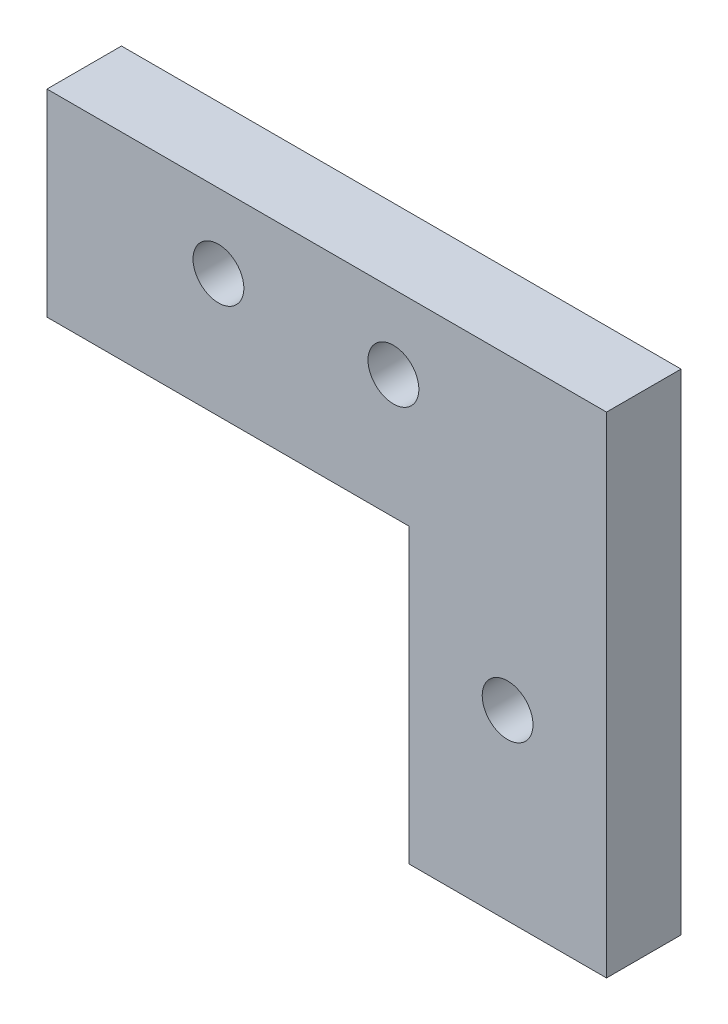
ISO-10303-21;
HEADER;
FILE_DESCRIPTION(('STEP AP214'),'2;1');
FILE_NAME('part.step','',(''),(''),'','','');
FILE_SCHEMA(('AUTOMOTIVE_DESIGN { 1 0 10303 214 1 1 1 1 }'));
ENDSEC;
DATA;
#1=APPLICATION_CONTEXT('core data for automotive mechanical design processes');
#2=APPLICATION_PROTOCOL_DEFINITION('international standard','automotive_design',2000,#1);
#3=PRODUCT_CONTEXT('',#1,'mechanical');
#4=PRODUCT('Part','Part','',(#3));
#5=PRODUCT_RELATED_PRODUCT_CATEGORY('part','',(#4));
#6=PRODUCT_DEFINITION_FORMATION('','',#4);
#7=PRODUCT_DEFINITION_CONTEXT('part definition',#1,'design');
#8=PRODUCT_DEFINITION('design','',#6,#7);
#9=PRODUCT_DEFINITION_SHAPE('','',#8);
#10=(LENGTH_UNIT() NAMED_UNIT(*) SI_UNIT(.MILLI.,.METRE.));
#11=(NAMED_UNIT(*) PLANE_ANGLE_UNIT() SI_UNIT($,.RADIAN.));
#12=(NAMED_UNIT(*) SI_UNIT($,.STERADIAN.) SOLID_ANGLE_UNIT());
#13=UNCERTAINTY_MEASURE_WITH_UNIT(LENGTH_MEASURE(1.E-05),#10,'distance_accuracy_value','');
#14=(GEOMETRIC_REPRESENTATION_CONTEXT(3) GLOBAL_UNCERTAINTY_ASSIGNED_CONTEXT((#13)) GLOBAL_UNIT_ASSIGNED_CONTEXT((#10,
#11,#12)) REPRESENTATION_CONTEXT('',''));
#15=CARTESIAN_POINT('',(0.,0.,0.));
#16=DIRECTION('',(0.,0.,1.));
#17=DIRECTION('',(1.,0.,0.));
#18=AXIS2_PLACEMENT_3D('',#15,#16,#17);
#19=CARTESIAN_POINT('',(0.,0.,42.65));
#20=DIRECTION('',(0.,-1.,0.));
#21=DIRECTION('',(1.,0.,0.));
#22=AXIS2_PLACEMENT_3D('',#19,#20,#21);
#23=PLANE('',#22);
#24=DIRECTION('',(0.,0.,-1.));
#25=VECTOR('',#24,1.);
#26=CARTESIAN_POINT('',(-25.65,0.,42.65));
#27=LINE('',#26,#25);
#28=CARTESIAN_POINT('',(-25.65,0.,5.28));
#29=VERTEX_POINT('',#28);
#30=CARTESIAN_POINT('',(-25.65,0.,0.));
#31=VERTEX_POINT('',#30);
#32=EDGE_CURVE('E11',#29,#31,#27,.T.);
#33=ORIENTED_EDGE('',*,*,#32,.F.);
#34=DIRECTION('',(-1.,0.,0.));
#35=VECTOR('',#34,1.);
#36=CARTESIAN_POINT('',(-36.4186276215853,0.,5.28));
#37=LINE('',#36,#35);
#38=CARTESIAN_POINT('',(14.,0.,5.28));
#39=VERTEX_POINT('',#38);
#40=EDGE_CURVE('E97',#39,#29,#37,.T.);
#41=ORIENTED_EDGE('',*,*,#40,.F.);
#42=DIRECTION('',(0.,0.,-1.));
#43=VECTOR('',#42,1.);
#44=CARTESIAN_POINT('',(14.,0.,42.65));
#45=LINE('',#44,#43);
#46=CARTESIAN_POINT('',(14.,0.,0.));
#47=VERTEX_POINT('',#46);
#48=EDGE_CURVE('E67',#39,#47,#45,.T.);
#49=ORIENTED_EDGE('',*,*,#48,.T.);
#50=DIRECTION('',(-1.,0.,0.));
#51=VECTOR('',#50,1.);
#52=CARTESIAN_POINT('',(0.,0.,0.));
#53=LINE('',#52,#51);
#54=EDGE_CURVE('E145',#47,#31,#53,.T.);
#55=ORIENTED_EDGE('',*,*,#54,.T.);
#56=EDGE_LOOP('',(#33,#41,#49,#55));
#57=FACE_BOUND('',#56,.T.);
#58=ADVANCED_FACE('F43',(#57),#23,.F.);
#59=CARTESIAN_POINT('',(-25.65,0.,42.65));
#60=DIRECTION('',(1.,0.,0.));
#61=DIRECTION('',(0.,1.,0.));
#62=AXIS2_PLACEMENT_3D('',#59,#60,#61);
#63=PLANE('',#62);
#64=DIRECTION('',(0.,0.,-1.));
#65=VECTOR('',#64,1.);
#66=CARTESIAN_POINT('',(-25.65,-14.,42.65));
#67=LINE('',#66,#65);
#68=CARTESIAN_POINT('',(-25.65,-14.,5.28));
#69=VERTEX_POINT('',#68);
#70=CARTESIAN_POINT('',(-25.65,-14.,0.));
#71=VERTEX_POINT('',#70);
#72=EDGE_CURVE('E52',#69,#71,#67,.T.);
#73=ORIENTED_EDGE('',*,*,#72,.F.);
#74=DIRECTION('',(0.,1.,0.));
#75=VECTOR('',#74,1.);
#76=CARTESIAN_POINT('',(-25.65,0.,5.28));
#77=LINE('',#76,#75);
#78=EDGE_CURVE('E188',#69,#29,#77,.T.);
#79=ORIENTED_EDGE('',*,*,#78,.T.);
#80=ORIENTED_EDGE('',*,*,#32,.T.);
#81=DIRECTION('',(0.,-1.,0.));
#82=VECTOR('',#81,1.);
#83=CARTESIAN_POINT('',(-25.65,0.,0.));
#84=LINE('',#83,#82);
#85=EDGE_CURVE('E141',#31,#71,#84,.T.);
#86=ORIENTED_EDGE('',*,*,#85,.T.);
#87=EDGE_LOOP('',(#73,#79,#80,#86));
#88=FACE_BOUND('',#87,.T.);
#89=ADVANCED_FACE('F142',(#88),#63,.F.);
#90=CARTESIAN_POINT('',(0.,-14.,42.65));
#91=DIRECTION('',(0.,-1.,0.));
#92=DIRECTION('',(1.,0.,0.));
#93=AXIS2_PLACEMENT_3D('',#90,#91,#92);
#94=PLANE('',#93);
#95=DIRECTION('',(1.,0.,0.));
#96=VECTOR('',#95,1.);
#97=CARTESIAN_POINT('',(0.,-14.,5.28));
#98=LINE('',#97,#96);
#99=CARTESIAN_POINT('',(0.,-14.,5.28));
#100=VERTEX_POINT('',#99);
#101=EDGE_CURVE('E138',#69,#100,#98,.T.);
#102=ORIENTED_EDGE('',*,*,#101,.F.);
#103=ORIENTED_EDGE('',*,*,#72,.T.);
#104=DIRECTION('',(-1.,0.,0.));
#105=VECTOR('',#104,1.);
#106=CARTESIAN_POINT('',(0.,-14.,0.));
#107=LINE('',#106,#105);
#108=CARTESIAN_POINT('',(0.,-14.,0.));
#109=VERTEX_POINT('',#108);
#110=EDGE_CURVE('E137',#109,#71,#107,.T.);
#111=ORIENTED_EDGE('',*,*,#110,.F.);
#112=DIRECTION('',(0.,0.,-1.));
#113=VECTOR('',#112,1.);
#114=CARTESIAN_POINT('',(0.,-14.,42.65));
#115=LINE('',#114,#113);
#116=EDGE_CURVE('E125',#100,#109,#115,.T.);
#117=ORIENTED_EDGE('',*,*,#116,.F.);
#118=EDGE_LOOP('',(#102,#103,#111,#117));
#119=FACE_BOUND('',#118,.T.);
#120=ADVANCED_FACE('F134',(#119),#94,.T.);
#121=CARTESIAN_POINT('',(0.,0.,42.65));
#122=DIRECTION('',(1.,0.,0.));
#123=DIRECTION('',(0.,1.,0.));
#124=AXIS2_PLACEMENT_3D('',#121,#122,#123);
#125=PLANE('',#124);
#126=DIRECTION('',(0.,0.,-1.));
#127=VECTOR('',#126,1.);
#128=CARTESIAN_POINT('',(0.,-34.73,42.65));
#129=LINE('',#128,#127);
#130=CARTESIAN_POINT('',(0.,-34.73,5.28));
#131=VERTEX_POINT('',#130);
#132=CARTESIAN_POINT('',(0.,-34.73,0.));
#133=VERTEX_POINT('',#132);
#134=EDGE_CURVE('E117',#131,#133,#129,.T.);
#135=ORIENTED_EDGE('',*,*,#134,.F.);
#136=DIRECTION('',(0.,1.,0.));
#137=VECTOR('',#136,1.);
#138=CARTESIAN_POINT('',(0.,0.,5.28));
#139=LINE('',#138,#137);
#140=EDGE_CURVE('E102',#131,#100,#139,.T.);
#141=ORIENTED_EDGE('',*,*,#140,.T.);
#142=ORIENTED_EDGE('',*,*,#116,.T.);
#143=DIRECTION('',(0.,-1.,0.));
#144=VECTOR('',#143,1.);
#145=CARTESIAN_POINT('',(0.,0.,0.));
#146=LINE('',#145,#144);
#147=EDGE_CURVE('E151',#109,#133,#146,.T.);
#148=ORIENTED_EDGE('',*,*,#147,.T.);
#149=EDGE_LOOP('',(#135,#141,#142,#148));
#150=FACE_BOUND('',#149,.T.);
#151=ADVANCED_FACE('F247',(#150),#125,.F.);
#152=CARTESIAN_POINT('',(0.,-34.73,42.65));
#153=DIRECTION('',(0.,1.,0.));
#154=DIRECTION('',(0.,0.,1.));
#155=AXIS2_PLACEMENT_3D('',#152,#153,#154);
#156=PLANE('',#155);
#157=DIRECTION('',(0.,0.,-1.));
#158=VECTOR('',#157,1.);
#159=CARTESIAN_POINT('',(14.,-34.73,42.65));
#160=LINE('',#159,#158);
#161=CARTESIAN_POINT('',(14.,-34.73,5.28));
#162=VERTEX_POINT('',#161);
#163=CARTESIAN_POINT('',(14.,-34.73,0.));
#164=VERTEX_POINT('',#163);
#165=EDGE_CURVE('E113',#162,#164,#160,.T.);
#166=ORIENTED_EDGE('',*,*,#165,.F.);
#167=DIRECTION('',(-1.,0.,0.));
#168=VECTOR('',#167,1.);
#169=CARTESIAN_POINT('',(-36.4186276215853,-34.73,5.28));
#170=LINE('',#169,#168);
#171=EDGE_CURVE('E59',#162,#131,#170,.T.);
#172=ORIENTED_EDGE('',*,*,#171,.T.);
#173=ORIENTED_EDGE('',*,*,#134,.T.);
#174=DIRECTION('',(1.,0.,0.));
#175=VECTOR('',#174,1.);
#176=CARTESIAN_POINT('',(0.,-34.73,0.));
#177=LINE('',#176,#175);
#178=EDGE_CURVE('E119',#133,#164,#177,.T.);
#179=ORIENTED_EDGE('',*,*,#178,.T.);
#180=EDGE_LOOP('',(#166,#172,#173,#179));
#181=FACE_BOUND('',#180,.T.);
#182=ADVANCED_FACE('F160',(#181),#156,.F.);
#183=CARTESIAN_POINT('',(14.,0.,42.65));
#184=DIRECTION('',(1.,0.,0.));
#185=DIRECTION('',(0.,1.,0.));
#186=AXIS2_PLACEMENT_3D('',#183,#184,#185);
#187=PLANE('',#186);
#188=DIRECTION('',(0.,1.,0.));
#189=VECTOR('',#188,1.);
#190=CARTESIAN_POINT('',(14.,0.,5.28));
#191=LINE('',#190,#189);
#192=EDGE_CURVE('E95',#162,#39,#191,.T.);
#193=ORIENTED_EDGE('',*,*,#192,.F.);
#194=ORIENTED_EDGE('',*,*,#165,.T.);
#195=DIRECTION('',(0.,-1.,0.));
#196=VECTOR('',#195,1.);
#197=CARTESIAN_POINT('',(14.,0.,0.));
#198=LINE('',#197,#196);
#199=EDGE_CURVE('E111',#47,#164,#198,.T.);
#200=ORIENTED_EDGE('',*,*,#199,.F.);
#201=ORIENTED_EDGE('',*,*,#48,.F.);
#202=EDGE_LOOP('',(#193,#194,#200,#201));
#203=FACE_BOUND('',#202,.T.);
#204=ADVANCED_FACE('F109',(#203),#187,.T.);
#205=CARTESIAN_POINT('',(0.,0.,0.));
#206=DIRECTION('',(0.,0.,1.));
#207=DIRECTION('',(1.,0.,0.));
#208=AXIS2_PLACEMENT_3D('',#205,#206,#207);
#209=PLANE('',#208);
#210=CARTESIAN_POINT('',(-1.10000000000001,-5.25,0.));
#211=DIRECTION('',(0.,0.,-1.));
#212=DIRECTION('',(-1.,0.,0.));
#213=AXIS2_PLACEMENT_3D('',#210,#211,#212);
#214=CIRCLE('',#213,1.825);
#215=CARTESIAN_POINT('',(-2.92500000000001,-5.25,0.));
#216=VERTEX_POINT('',#215);
#217=EDGE_CURVE('E184',#216,#216,#214,.T.);
#218=ORIENTED_EDGE('',*,*,#217,.F.);
#219=EDGE_LOOP('',(#218));
#220=FACE_BOUND('',#219,.T.);
#221=CARTESIAN_POINT('',(-13.5,-5.25,0.));
#222=DIRECTION('',(0.,0.,-1.));
#223=DIRECTION('',(-1.,0.,0.));
#224=AXIS2_PLACEMENT_3D('',#221,#222,#223);
#225=CIRCLE('',#224,1.825);
#226=CARTESIAN_POINT('',(-15.325,-5.25,0.));
#227=VERTEX_POINT('',#226);
#228=EDGE_CURVE('E176',#227,#227,#225,.T.);
#229=ORIENTED_EDGE('',*,*,#228,.F.);
#230=EDGE_LOOP('',(#229));
#231=FACE_BOUND('',#230,.T.);
#232=CARTESIAN_POINT('',(6.98999999999999,-21.8,0.));
#233=DIRECTION('',(0.,0.,-1.));
#234=DIRECTION('',(-1.,0.,0.));
#235=AXIS2_PLACEMENT_3D('',#232,#233,#234);
#236=CIRCLE('',#235,1.825);
#237=CARTESIAN_POINT('',(5.16499999999999,-21.8,0.));
#238=VERTEX_POINT('',#237);
#239=EDGE_CURVE('E166',#238,#238,#236,.T.);
#240=ORIENTED_EDGE('',*,*,#239,.F.);
#241=EDGE_LOOP('',(#240));
#242=FACE_BOUND('',#241,.T.);
#243=ORIENTED_EDGE('',*,*,#54,.F.);
#244=ORIENTED_EDGE('',*,*,#199,.T.);
#245=ORIENTED_EDGE('',*,*,#178,.F.);
#246=ORIENTED_EDGE('',*,*,#147,.F.);
#247=ORIENTED_EDGE('',*,*,#110,.T.);
#248=ORIENTED_EDGE('',*,*,#85,.F.);
#249=EDGE_LOOP('',(#243,#244,#245,#246,#247,#248));
#250=FACE_BOUND('',#249,.T.);
#251=ADVANCED_FACE('F148',(#220,#231,#242,#250),#209,.F.);
#252=CARTESIAN_POINT('',(6.98999999999999,-21.8,0.));
#253=DIRECTION('',(0.,0.,-1.));
#254=DIRECTION('',(-1.,0.,0.));
#255=AXIS2_PLACEMENT_3D('',#252,#253,#254);
#256=CYLINDRICAL_SURFACE('',#255,1.8);
#257=CARTESIAN_POINT('',(6.98999999999999,-21.8,5.28));
#258=DIRECTION('',(0.,0.,-1.));
#259=DIRECTION('',(-1.,0.,0.));
#260=AXIS2_PLACEMENT_3D('',#257,#258,#259);
#261=CIRCLE('',#260,1.8);
#262=CARTESIAN_POINT('',(5.18999999999999,-21.8,5.28));
#263=VERTEX_POINT('',#262);
#264=EDGE_CURVE('E103',#263,#263,#261,.F.);
#265=ORIENTED_EDGE('',*,*,#264,.T.);
#266=EDGE_LOOP('',(#265));
#267=FACE_BOUND('',#266,.T.);
#268=CARTESIAN_POINT('',(6.98999999999999,-21.8,0.0250000000000025));
#269=DIRECTION('',(0.,0.,-1.));
#270=DIRECTION('',(-1.,0.,0.));
#271=AXIS2_PLACEMENT_3D('',#268,#269,#270);
#272=CIRCLE('',#271,1.8);
#273=CARTESIAN_POINT('',(5.18999999999999,-21.8,0.0250000000000025));
#274=VERTEX_POINT('',#273);
#275=EDGE_CURVE('E163',#274,#274,#272,.T.);
#276=ORIENTED_EDGE('',*,*,#275,.T.);
#277=EDGE_LOOP('',(#276));
#278=FACE_BOUND('',#277,.T.);
#279=ADVANCED_FACE('F218',(#267,#278),#256,.F.);
#280=CARTESIAN_POINT('',(6.98999999999999,-21.8,0.));
#281=DIRECTION('',(0.,0.,-1.));
#282=DIRECTION('',(-1.,0.,0.));
#283=AXIS2_PLACEMENT_3D('',#280,#281,#282);
#284=CONICAL_SURFACE('',#283,1.825,0.785398163397414);
#285=ORIENTED_EDGE('',*,*,#275,.F.);
#286=EDGE_LOOP('',(#285));
#287=FACE_BOUND('',#286,.T.);
#288=ORIENTED_EDGE('',*,*,#239,.T.);
#289=EDGE_LOOP('',(#288));
#290=FACE_BOUND('',#289,.T.);
#291=ADVANCED_FACE('F221',(#287,#290),#284,.F.);
#292=CARTESIAN_POINT('',(-13.5,-5.25,0.));
#293=DIRECTION('',(0.,0.,-1.));
#294=DIRECTION('',(-1.,0.,0.));
#295=AXIS2_PLACEMENT_3D('',#292,#293,#294);
#296=CYLINDRICAL_SURFACE('',#295,1.8);
#297=CARTESIAN_POINT('',(-13.5,-5.25,5.28));
#298=DIRECTION('',(0.,0.,-1.));
#299=DIRECTION('',(-1.,0.,0.));
#300=AXIS2_PLACEMENT_3D('',#297,#298,#299);
#301=CIRCLE('',#300,1.8);
#302=CARTESIAN_POINT('',(-15.3,-5.25,5.28));
#303=VERTEX_POINT('',#302);
#304=EDGE_CURVE('E199',#303,#303,#301,.F.);
#305=ORIENTED_EDGE('',*,*,#304,.T.);
#306=EDGE_LOOP('',(#305));
#307=FACE_BOUND('',#306,.T.);
#308=CARTESIAN_POINT('',(-13.5,-5.25,0.0250000000000025));
#309=DIRECTION('',(0.,0.,-1.));
#310=DIRECTION('',(-1.,0.,0.));
#311=AXIS2_PLACEMENT_3D('',#308,#309,#310);
#312=CIRCLE('',#311,1.8);
#313=CARTESIAN_POINT('',(-15.3,-5.25,0.0250000000000025));
#314=VERTEX_POINT('',#313);
#315=EDGE_CURVE('E172',#314,#314,#312,.T.);
#316=ORIENTED_EDGE('',*,*,#315,.T.);
#317=EDGE_LOOP('',(#316));
#318=FACE_BOUND('',#317,.T.);
#319=ADVANCED_FACE('F227',(#307,#318),#296,.F.);
#320=CARTESIAN_POINT('',(-13.5,-5.25,0.));
#321=DIRECTION('',(0.,0.,-1.));
#322=DIRECTION('',(-1.,0.,0.));
#323=AXIS2_PLACEMENT_3D('',#320,#321,#322);
#324=CONICAL_SURFACE('',#323,1.825,0.785398163397414);
#325=ORIENTED_EDGE('',*,*,#315,.F.);
#326=EDGE_LOOP('',(#325));
#327=FACE_BOUND('',#326,.T.);
#328=ORIENTED_EDGE('',*,*,#228,.T.);
#329=EDGE_LOOP('',(#328));
#330=FACE_BOUND('',#329,.T.);
#331=ADVANCED_FACE('F282',(#327,#330),#324,.F.);
#332=CARTESIAN_POINT('',(-1.10000000000001,-5.25,0.));
#333=DIRECTION('',(0.,0.,-1.));
#334=DIRECTION('',(-1.,0.,0.));
#335=AXIS2_PLACEMENT_3D('',#332,#333,#334);
#336=CYLINDRICAL_SURFACE('',#335,1.8);
#337=CARTESIAN_POINT('',(-1.10000000000001,-5.25,5.28));
#338=DIRECTION('',(0.,0.,-1.));
#339=DIRECTION('',(-1.,0.,0.));
#340=AXIS2_PLACEMENT_3D('',#337,#338,#339);
#341=CIRCLE('',#340,1.8);
#342=CARTESIAN_POINT('',(-2.90000000000001,-5.25,5.28));
#343=VERTEX_POINT('',#342);
#344=EDGE_CURVE('E46',#343,#343,#341,.F.);
#345=ORIENTED_EDGE('',*,*,#344,.T.);
#346=EDGE_LOOP('',(#345));
#347=FACE_BOUND('',#346,.T.);
#348=CARTESIAN_POINT('',(-1.10000000000001,-5.25,0.0250000000000025));
#349=DIRECTION('',(0.,0.,-1.));
#350=DIRECTION('',(-1.,0.,0.));
#351=AXIS2_PLACEMENT_3D('',#348,#349,#350);
#352=CIRCLE('',#351,1.8);
#353=CARTESIAN_POINT('',(-2.90000000000001,-5.25,0.0250000000000025));
#354=VERTEX_POINT('',#353);
#355=EDGE_CURVE('E180',#354,#354,#352,.T.);
#356=ORIENTED_EDGE('',*,*,#355,.T.);
#357=EDGE_LOOP('',(#356));
#358=FACE_BOUND('',#357,.T.);
#359=ADVANCED_FACE('F208',(#347,#358),#336,.F.);
#360=CARTESIAN_POINT('',(-1.10000000000001,-5.25,0.));
#361=DIRECTION('',(0.,0.,-1.));
#362=DIRECTION('',(-1.,0.,0.));
#363=AXIS2_PLACEMENT_3D('',#360,#361,#362);
#364=CONICAL_SURFACE('',#363,1.825,0.785398163397422);
#365=ORIENTED_EDGE('',*,*,#355,.F.);
#366=EDGE_LOOP('',(#365));
#367=FACE_BOUND('',#366,.T.);
#368=ORIENTED_EDGE('',*,*,#217,.T.);
#369=EDGE_LOOP('',(#368));
#370=FACE_BOUND('',#369,.T.);
#371=ADVANCED_FACE('F213',(#367,#370),#364,.F.);
#372=CARTESIAN_POINT('',(-36.4186276215853,-34.73,5.28));
#373=DIRECTION('',(0.,0.,-1.));
#374=DIRECTION('',(-1.,0.,0.));
#375=AXIS2_PLACEMENT_3D('',#372,#373,#374);
#376=PLANE('',#375);
#377=ORIENTED_EDGE('',*,*,#304,.F.);
#378=EDGE_LOOP('',(#377));
#379=FACE_BOUND('',#378,.T.);
#380=ORIENTED_EDGE('',*,*,#344,.F.);
#381=EDGE_LOOP('',(#380));
#382=FACE_BOUND('',#381,.T.);
#383=ORIENTED_EDGE('',*,*,#264,.F.);
#384=EDGE_LOOP('',(#383));
#385=FACE_BOUND('',#384,.T.);
#386=ORIENTED_EDGE('',*,*,#101,.T.);
#387=ORIENTED_EDGE('',*,*,#140,.F.);
#388=ORIENTED_EDGE('',*,*,#171,.F.);
#389=ORIENTED_EDGE('',*,*,#192,.T.);
#390=ORIENTED_EDGE('',*,*,#40,.T.);
#391=ORIENTED_EDGE('',*,*,#78,.F.);
#392=EDGE_LOOP('',(#386,#387,#388,#389,#390,#391));
#393=FACE_BOUND('',#392,.T.);
#394=ADVANCED_FACE('F96',(#379,#382,#385,#393),#376,.F.);
#395=CLOSED_SHELL('',(#58,#89,#120,#151,#182,#204,#251,#279,#291,#319,#331,#359,#371,#394));
#396=MANIFOLD_SOLID_BREP('B2',#395);
#397=ADVANCED_BREP_SHAPE_REPRESENTATION('',(#18,#396),#14);
#398=SHAPE_DEFINITION_REPRESENTATION(#9,#397);
ENDSEC;
END-ISO-10303-21;
